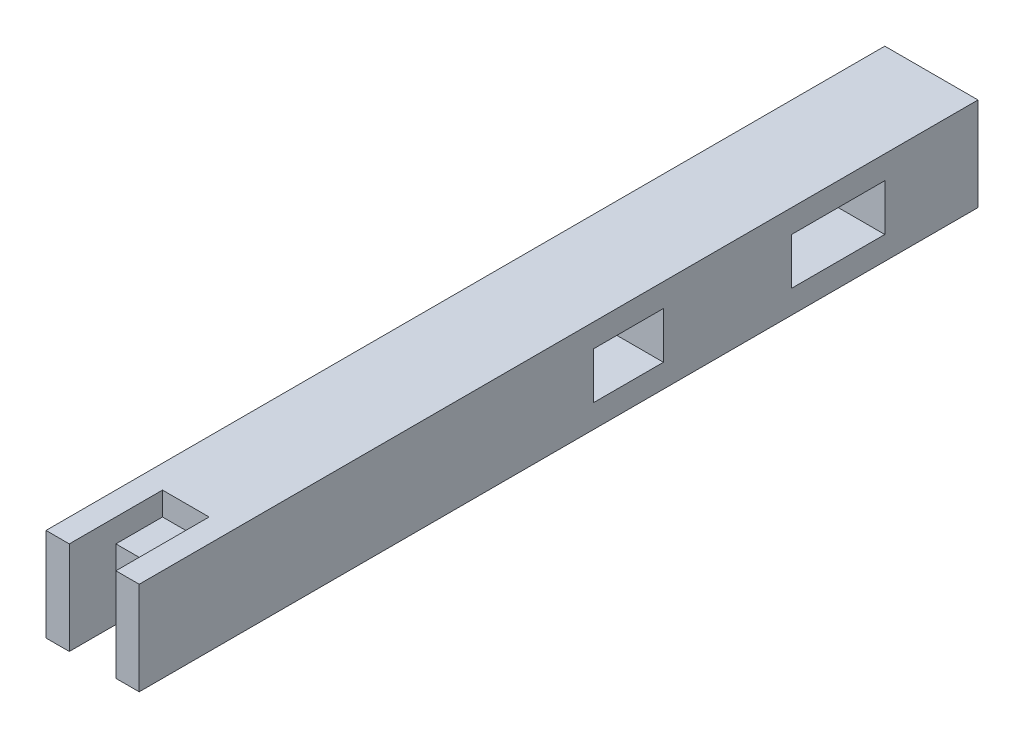
ISO-10303-21;
HEADER;
FILE_DESCRIPTION(('STEP AP214'),'2;1');
FILE_NAME('part.step','',(''),(''),'','','');
FILE_SCHEMA(('AUTOMOTIVE_DESIGN { 1 0 10303 214 1 1 1 1 }'));
ENDSEC;
DATA;
#1=APPLICATION_CONTEXT('core data for automotive mechanical design processes');
#2=APPLICATION_PROTOCOL_DEFINITION('international standard','automotive_design',2000,#1);
#3=PRODUCT_CONTEXT('',#1,'mechanical');
#4=PRODUCT('Part','Part','',(#3));
#5=PRODUCT_RELATED_PRODUCT_CATEGORY('part','',(#4));
#6=PRODUCT_DEFINITION_FORMATION('','',#4);
#7=PRODUCT_DEFINITION_CONTEXT('part definition',#1,'design');
#8=PRODUCT_DEFINITION('design','',#6,#7);
#9=PRODUCT_DEFINITION_SHAPE('','',#8);
#10=(LENGTH_UNIT() NAMED_UNIT(*) SI_UNIT(.MILLI.,.METRE.));
#11=(NAMED_UNIT(*) PLANE_ANGLE_UNIT() SI_UNIT($,.RADIAN.));
#12=(NAMED_UNIT(*) SI_UNIT($,.STERADIAN.) SOLID_ANGLE_UNIT());
#13=UNCERTAINTY_MEASURE_WITH_UNIT(LENGTH_MEASURE(1.E-05),#10,'distance_accuracy_value','');
#14=(GEOMETRIC_REPRESENTATION_CONTEXT(3) GLOBAL_UNCERTAINTY_ASSIGNED_CONTEXT((#13)) GLOBAL_UNIT_ASSIGNED_CONTEXT((#10,
#11,#12)) REPRESENTATION_CONTEXT('',''));
#15=CARTESIAN_POINT('',(0.,0.,0.));
#16=DIRECTION('',(0.,0.,1.));
#17=DIRECTION('',(1.,0.,0.));
#18=AXIS2_PLACEMENT_3D('',#15,#16,#17);
#19=CARTESIAN_POINT('',(0.,0.,914.4));
#20=DIRECTION('',(0.,0.,-1.));
#21=DIRECTION('',(-1.,0.,0.));
#22=AXIS2_PLACEMENT_3D('',#19,#20,#21);
#23=PLANE('',#22);
#24=DIRECTION('',(-1.,0.,0.));
#25=VECTOR('',#24,1.);
#26=CARTESIAN_POINT('',(-50.8,50.8,914.4));
#27=LINE('',#26,#25);
#28=CARTESIAN_POINT('',(50.8,50.8,914.4));
#29=VERTEX_POINT('',#28);
#30=CARTESIAN_POINT('',(25.4,50.8,914.4));
#31=VERTEX_POINT('',#30);
#32=EDGE_CURVE('E358',#29,#31,#27,.T.);
#33=ORIENTED_EDGE('',*,*,#32,.T.);
#34=DIRECTION('',(0.,1.,0.));
#35=VECTOR('',#34,1.);
#36=CARTESIAN_POINT('',(25.4,-50.8,914.4));
#37=LINE('',#36,#35);
#38=CARTESIAN_POINT('',(25.4,-50.8,914.4));
#39=VERTEX_POINT('',#38);
#40=EDGE_CURVE('E253',#39,#31,#37,.T.);
#41=ORIENTED_EDGE('',*,*,#40,.F.);
#42=DIRECTION('',(1.,0.,0.));
#43=VECTOR('',#42,1.);
#44=CARTESIAN_POINT('',(-50.8,-50.8,914.4));
#45=LINE('',#44,#43);
#46=CARTESIAN_POINT('',(50.8,-50.8,914.4));
#47=VERTEX_POINT('',#46);
#48=EDGE_CURVE('E365',#39,#47,#45,.T.);
#49=ORIENTED_EDGE('',*,*,#48,.T.);
#50=DIRECTION('',(0.,1.,0.));
#51=VECTOR('',#50,1.);
#52=CARTESIAN_POINT('',(50.8,-50.8,914.4));
#53=LINE('',#52,#51);
#54=EDGE_CURVE('E352',#47,#29,#53,.T.);
#55=ORIENTED_EDGE('',*,*,#54,.T.);
#56=EDGE_LOOP('',(#33,#41,#49,#55));
#57=FACE_BOUND('',#56,.T.);
#58=ADVANCED_FACE('F42',(#57),#23,.F.);
#59=CARTESIAN_POINT('',(50.8,-50.8,914.4));
#60=DIRECTION('',(-1.,0.,0.));
#61=DIRECTION('',(0.,0.,1.));
#62=AXIS2_PLACEMENT_3D('',#59,#60,#61);
#63=PLANE('',#62);
#64=DIRECTION('',(0.,0.,-1.));
#65=VECTOR('',#64,1.);
#66=CARTESIAN_POINT('',(50.8,25.4,419.1));
#67=LINE('',#66,#65);
#68=CARTESIAN_POINT('',(50.8,25.4,419.1));
#69=VERTEX_POINT('',#68);
#70=CARTESIAN_POINT('',(50.8,25.4,342.9));
#71=VERTEX_POINT('',#70);
#72=EDGE_CURVE('E189',#69,#71,#67,.T.);
#73=ORIENTED_EDGE('',*,*,#72,.T.);
#74=DIRECTION('',(0.,-1.,0.));
#75=VECTOR('',#74,1.);
#76=CARTESIAN_POINT('',(50.8,25.4,342.9));
#77=LINE('',#76,#75);
#78=CARTESIAN_POINT('',(50.8,-25.4,342.9));
#79=VERTEX_POINT('',#78);
#80=EDGE_CURVE('E182',#71,#79,#77,.T.);
#81=ORIENTED_EDGE('',*,*,#80,.T.);
#82=DIRECTION('',(0.,0.,1.));
#83=VECTOR('',#82,1.);
#84=CARTESIAN_POINT('',(50.8,-25.4,419.1));
#85=LINE('',#84,#83);
#86=CARTESIAN_POINT('',(50.8,-25.4,419.1));
#87=VERTEX_POINT('',#86);
#88=EDGE_CURVE('E192',#79,#87,#85,.T.);
#89=ORIENTED_EDGE('',*,*,#88,.T.);
#90=DIRECTION('',(0.,1.,0.));
#91=VECTOR('',#90,1.);
#92=CARTESIAN_POINT('',(50.8,25.4,419.1));
#93=LINE('',#92,#91);
#94=EDGE_CURVE('E58',#87,#69,#93,.T.);
#95=ORIENTED_EDGE('',*,*,#94,.T.);
#96=EDGE_LOOP('',(#73,#81,#89,#95));
#97=FACE_BOUND('',#96,.T.);
#98=DIRECTION('',(0.,0.,1.));
#99=VECTOR('',#98,1.);
#100=CARTESIAN_POINT('',(50.8,25.4,203.2));
#101=LINE('',#100,#99);
#102=CARTESIAN_POINT('',(50.8,25.4,101.6));
#103=VERTEX_POINT('',#102);
#104=CARTESIAN_POINT('',(50.8,25.4,203.2));
#105=VERTEX_POINT('',#104);
#106=EDGE_CURVE('E328',#103,#105,#101,.T.);
#107=ORIENTED_EDGE('',*,*,#106,.F.);
#108=DIRECTION('',(0.,1.,0.));
#109=VECTOR('',#108,1.);
#110=CARTESIAN_POINT('',(50.8,-25.4,101.6));
#111=LINE('',#110,#109);
#112=CARTESIAN_POINT('',(50.8,-25.4,101.6));
#113=VERTEX_POINT('',#112);
#114=EDGE_CURVE('E297',#113,#103,#111,.T.);
#115=ORIENTED_EDGE('',*,*,#114,.F.);
#116=DIRECTION('',(0.,0.,-1.));
#117=VECTOR('',#116,1.);
#118=CARTESIAN_POINT('',(50.8,-25.4,203.2));
#119=LINE('',#118,#117);
#120=CARTESIAN_POINT('',(50.8,-25.4,203.2));
#121=VERTEX_POINT('',#120);
#122=EDGE_CURVE('E313',#121,#113,#119,.T.);
#123=ORIENTED_EDGE('',*,*,#122,.F.);
#124=DIRECTION('',(0.,-1.,0.));
#125=VECTOR('',#124,1.);
#126=CARTESIAN_POINT('',(50.8,-25.4,203.2));
#127=LINE('',#126,#125);
#128=EDGE_CURVE('E332',#105,#121,#127,.T.);
#129=ORIENTED_EDGE('',*,*,#128,.F.);
#130=EDGE_LOOP('',(#107,#115,#123,#129));
#131=FACE_BOUND('',#130,.T.);
#132=DIRECTION('',(0.,1.,0.));
#133=VECTOR('',#132,1.);
#134=CARTESIAN_POINT('',(50.8,-50.8,0.));
#135=LINE('',#134,#133);
#136=CARTESIAN_POINT('',(50.8,-50.8,0.));
#137=VERTEX_POINT('',#136);
#138=CARTESIAN_POINT('',(50.8,50.8,0.));
#139=VERTEX_POINT('',#138);
#140=EDGE_CURVE('E342',#137,#139,#135,.T.);
#141=ORIENTED_EDGE('',*,*,#140,.T.);
#142=DIRECTION('',(0.,0.,-1.));
#143=VECTOR('',#142,1.);
#144=CARTESIAN_POINT('',(50.8,50.8,914.4));
#145=LINE('',#144,#143);
#146=EDGE_CURVE('E11',#29,#139,#145,.T.);
#147=ORIENTED_EDGE('',*,*,#146,.F.);
#148=ORIENTED_EDGE('',*,*,#54,.F.);
#149=DIRECTION('',(0.,0.,-1.));
#150=VECTOR('',#149,1.);
#151=CARTESIAN_POINT('',(50.8,-50.8,914.4));
#152=LINE('',#151,#150);
#153=EDGE_CURVE('E370',#47,#137,#152,.T.);
#154=ORIENTED_EDGE('',*,*,#153,.T.);
#155=EDGE_LOOP('',(#141,#147,#148,#154));
#156=FACE_BOUND('',#155,.T.);
#157=ADVANCED_FACE('F44',(#97,#131,#156),#63,.F.);
#158=CARTESIAN_POINT('',(-50.8,50.8,914.4));
#159=DIRECTION('',(0.,-1.,0.));
#160=DIRECTION('',(0.,0.,-1.));
#161=AXIS2_PLACEMENT_3D('',#158,#159,#160);
#162=PLANE('',#161);
#163=DIRECTION('',(0.,0.,1.));
#164=VECTOR('',#163,1.);
#165=CARTESIAN_POINT('',(-25.4,50.8,863.6));
#166=LINE('',#165,#164);
#167=CARTESIAN_POINT('',(-25.4,50.8,812.8));
#168=VERTEX_POINT('',#167);
#169=CARTESIAN_POINT('',(-25.4,50.8,914.4));
#170=VERTEX_POINT('',#169);
#171=EDGE_CURVE('E302',#168,#170,#166,.T.);
#172=ORIENTED_EDGE('',*,*,#171,.F.);
#173=DIRECTION('',(-1.,0.,0.));
#174=VECTOR('',#173,1.);
#175=CARTESIAN_POINT('',(-25.4,50.8,812.8));
#176=LINE('',#175,#174);
#177=CARTESIAN_POINT('',(25.4,50.8,812.8));
#178=VERTEX_POINT('',#177);
#179=EDGE_CURVE('E241',#178,#168,#176,.T.);
#180=ORIENTED_EDGE('',*,*,#179,.F.);
#181=DIRECTION('',(0.,0.,1.));
#182=VECTOR('',#181,1.);
#183=CARTESIAN_POINT('',(25.4,50.8,863.6));
#184=LINE('',#183,#182);
#185=EDGE_CURVE('E289',#178,#31,#184,.T.);
#186=ORIENTED_EDGE('',*,*,#185,.T.);
#187=ORIENTED_EDGE('',*,*,#32,.F.);
#188=ORIENTED_EDGE('',*,*,#146,.T.);
#189=DIRECTION('',(-1.,0.,0.));
#190=VECTOR('',#189,1.);
#191=CARTESIAN_POINT('',(-50.8,50.8,0.));
#192=LINE('',#191,#190);
#193=CARTESIAN_POINT('',(-50.8,50.8,0.));
#194=VERTEX_POINT('',#193);
#195=EDGE_CURVE('E374',#139,#194,#192,.T.);
#196=ORIENTED_EDGE('',*,*,#195,.T.);
#197=DIRECTION('',(0.,0.,-1.));
#198=VECTOR('',#197,1.);
#199=CARTESIAN_POINT('',(-50.8,50.8,914.4));
#200=LINE('',#199,#198);
#201=CARTESIAN_POINT('',(-50.8,50.8,914.4));
#202=VERTEX_POINT('',#201);
#203=EDGE_CURVE('E51',#202,#194,#200,.T.);
#204=ORIENTED_EDGE('',*,*,#203,.F.);
#205=EDGE_CURVE('E356',#170,#202,#27,.T.);
#206=ORIENTED_EDGE('',*,*,#205,.F.);
#207=EDGE_LOOP('',(#172,#180,#186,#187,#188,#196,#204,#206));
#208=FACE_BOUND('',#207,.T.);
#209=ADVANCED_FACE('F418',(#208),#162,.F.);
#210=CARTESIAN_POINT('',(-50.8,-50.8,914.4));
#211=DIRECTION('',(1.,0.,0.));
#212=DIRECTION('',(0.,0.,-1.));
#213=AXIS2_PLACEMENT_3D('',#210,#211,#212);
#214=PLANE('',#213);
#215=DIRECTION('',(0.,0.,1.));
#216=VECTOR('',#215,1.);
#217=CARTESIAN_POINT('',(-50.8,-25.4,419.1));
#218=LINE('',#217,#216);
#219=CARTESIAN_POINT('',(-50.8,-25.4,342.9));
#220=VERTEX_POINT('',#219);
#221=CARTESIAN_POINT('',(-50.8,-25.4,419.1));
#222=VERTEX_POINT('',#221);
#223=EDGE_CURVE('E213',#220,#222,#218,.T.);
#224=ORIENTED_EDGE('',*,*,#223,.F.);
#225=DIRECTION('',(0.,-1.,0.));
#226=VECTOR('',#225,1.);
#227=CARTESIAN_POINT('',(-50.8,25.4,342.9));
#228=LINE('',#227,#226);
#229=CARTESIAN_POINT('',(-50.8,25.4,342.9));
#230=VERTEX_POINT('',#229);
#231=EDGE_CURVE('E66',#230,#220,#228,.T.);
#232=ORIENTED_EDGE('',*,*,#231,.F.);
#233=DIRECTION('',(0.,0.,-1.));
#234=VECTOR('',#233,1.);
#235=CARTESIAN_POINT('',(-50.8,25.4,419.1));
#236=LINE('',#235,#234);
#237=CARTESIAN_POINT('',(-50.8,25.4,419.1));
#238=VERTEX_POINT('',#237);
#239=EDGE_CURVE('E200',#238,#230,#236,.T.);
#240=ORIENTED_EDGE('',*,*,#239,.F.);
#241=DIRECTION('',(0.,1.,0.));
#242=VECTOR('',#241,1.);
#243=CARTESIAN_POINT('',(-50.8,25.4,419.1));
#244=LINE('',#243,#242);
#245=EDGE_CURVE('E204',#222,#238,#244,.T.);
#246=ORIENTED_EDGE('',*,*,#245,.F.);
#247=EDGE_LOOP('',(#224,#232,#240,#246));
#248=FACE_BOUND('',#247,.T.);
#249=DIRECTION('',(0.,0.,-1.));
#250=VECTOR('',#249,1.);
#251=CARTESIAN_POINT('',(-50.8,-25.4,203.2));
#252=LINE('',#251,#250);
#253=CARTESIAN_POINT('',(-50.8,-25.4,203.2));
#254=VERTEX_POINT('',#253);
#255=CARTESIAN_POINT('',(-50.8,-25.4,101.6));
#256=VERTEX_POINT('',#255);
#257=EDGE_CURVE('E321',#254,#256,#252,.T.);
#258=ORIENTED_EDGE('',*,*,#257,.T.);
#259=DIRECTION('',(0.,1.,0.));
#260=VECTOR('',#259,1.);
#261=CARTESIAN_POINT('',(-50.8,-25.4,101.6));
#262=LINE('',#261,#260);
#263=CARTESIAN_POINT('',(-50.8,25.4,101.6));
#264=VERTEX_POINT('',#263);
#265=EDGE_CURVE('E308',#256,#264,#262,.T.);
#266=ORIENTED_EDGE('',*,*,#265,.T.);
#267=DIRECTION('',(0.,0.,1.));
#268=VECTOR('',#267,1.);
#269=CARTESIAN_POINT('',(-50.8,25.4,203.2));
#270=LINE('',#269,#268);
#271=CARTESIAN_POINT('',(-50.8,25.4,203.2));
#272=VERTEX_POINT('',#271);
#273=EDGE_CURVE('E312',#264,#272,#270,.T.);
#274=ORIENTED_EDGE('',*,*,#273,.T.);
#275=DIRECTION('',(0.,-1.,0.));
#276=VECTOR('',#275,1.);
#277=CARTESIAN_POINT('',(-50.8,-25.4,203.2));
#278=LINE('',#277,#276);
#279=EDGE_CURVE('E317',#272,#254,#278,.T.);
#280=ORIENTED_EDGE('',*,*,#279,.T.);
#281=EDGE_LOOP('',(#258,#266,#274,#280));
#282=FACE_BOUND('',#281,.T.);
#283=DIRECTION('',(0.,-1.,0.));
#284=VECTOR('',#283,1.);
#285=CARTESIAN_POINT('',(-50.8,-50.8,0.));
#286=LINE('',#285,#284);
#287=CARTESIAN_POINT('',(-50.8,-50.8,0.));
#288=VERTEX_POINT('',#287);
#289=EDGE_CURVE('E377',#194,#288,#286,.T.);
#290=ORIENTED_EDGE('',*,*,#289,.T.);
#291=DIRECTION('',(0.,0.,-1.));
#292=VECTOR('',#291,1.);
#293=CARTESIAN_POINT('',(-50.8,-50.8,914.4));
#294=LINE('',#293,#292);
#295=CARTESIAN_POINT('',(-50.8,-50.8,914.4));
#296=VERTEX_POINT('',#295);
#297=EDGE_CURVE('E385',#296,#288,#294,.T.);
#298=ORIENTED_EDGE('',*,*,#297,.F.);
#299=DIRECTION('',(0.,-1.,0.));
#300=VECTOR('',#299,1.);
#301=CARTESIAN_POINT('',(-50.8,-50.8,914.4));
#302=LINE('',#301,#300);
#303=EDGE_CURVE('E362',#202,#296,#302,.T.);
#304=ORIENTED_EDGE('',*,*,#303,.F.);
#305=ORIENTED_EDGE('',*,*,#203,.T.);
#306=EDGE_LOOP('',(#290,#298,#304,#305));
#307=FACE_BOUND('',#306,.T.);
#308=ADVANCED_FACE('F394',(#248,#282,#307),#214,.F.);
#309=CARTESIAN_POINT('',(-50.8,-50.8,914.4));
#310=DIRECTION('',(0.,1.,0.));
#311=DIRECTION('',(0.,0.,1.));
#312=AXIS2_PLACEMENT_3D('',#309,#310,#311);
#313=PLANE('',#312);
#314=DIRECTION('',(1.,0.,0.));
#315=VECTOR('',#314,1.);
#316=CARTESIAN_POINT('',(-25.4,-50.8,812.8));
#317=LINE('',#316,#315);
#318=CARTESIAN_POINT('',(-25.4,-50.8,812.8));
#319=VERTEX_POINT('',#318);
#320=CARTESIAN_POINT('',(25.4,-50.8,812.8));
#321=VERTEX_POINT('',#320);
#322=EDGE_CURVE('E273',#319,#321,#317,.T.);
#323=ORIENTED_EDGE('',*,*,#322,.F.);
#324=DIRECTION('',(0.,0.,1.));
#325=VECTOR('',#324,1.);
#326=CARTESIAN_POINT('',(-25.4,-50.8,863.6));
#327=LINE('',#326,#325);
#328=CARTESIAN_POINT('',(-25.4,-50.8,914.4));
#329=VERTEX_POINT('',#328);
#330=EDGE_CURVE('E298',#319,#329,#327,.T.);
#331=ORIENTED_EDGE('',*,*,#330,.T.);
#332=EDGE_CURVE('E366',#296,#329,#45,.T.);
#333=ORIENTED_EDGE('',*,*,#332,.F.);
#334=ORIENTED_EDGE('',*,*,#297,.T.);
#335=DIRECTION('',(1.,0.,0.));
#336=VECTOR('',#335,1.);
#337=CARTESIAN_POINT('',(-50.8,-50.8,0.));
#338=LINE('',#337,#336);
#339=EDGE_CURVE('E357',#288,#137,#338,.T.);
#340=ORIENTED_EDGE('',*,*,#339,.T.);
#341=ORIENTED_EDGE('',*,*,#153,.F.);
#342=ORIENTED_EDGE('',*,*,#48,.F.);
#343=DIRECTION('',(0.,0.,1.));
#344=VECTOR('',#343,1.);
#345=CARTESIAN_POINT('',(25.4,-50.8,863.6));
#346=LINE('',#345,#344);
#347=EDGE_CURVE('E294',#321,#39,#346,.T.);
#348=ORIENTED_EDGE('',*,*,#347,.F.);
#349=EDGE_LOOP('',(#323,#331,#333,#334,#340,#341,#342,#348));
#350=FACE_BOUND('',#349,.T.);
#351=ADVANCED_FACE('F405',(#350),#313,.F.);
#352=ORIENTED_EDGE('',*,*,#332,.T.);
#353=DIRECTION('',(0.,-1.,0.));
#354=VECTOR('',#353,1.);
#355=CARTESIAN_POINT('',(-25.4,-50.8,914.4));
#356=LINE('',#355,#354);
#357=EDGE_CURVE('E285',#170,#329,#356,.T.);
#358=ORIENTED_EDGE('',*,*,#357,.F.);
#359=ORIENTED_EDGE('',*,*,#205,.T.);
#360=ORIENTED_EDGE('',*,*,#303,.T.);
#361=EDGE_LOOP('',(#352,#358,#359,#360));
#362=FACE_BOUND('',#361,.T.);
#363=ADVANCED_FACE('F417',(#362),#23,.F.);
#364=CARTESIAN_POINT('',(0.,0.,0.));
#365=DIRECTION('',(0.,0.,-1.));
#366=DIRECTION('',(-1.,0.,0.));
#367=AXIS2_PLACEMENT_3D('',#364,#365,#366);
#368=PLANE('',#367);
#369=ORIENTED_EDGE('',*,*,#140,.F.);
#370=ORIENTED_EDGE('',*,*,#339,.F.);
#371=ORIENTED_EDGE('',*,*,#289,.F.);
#372=ORIENTED_EDGE('',*,*,#195,.F.);
#373=EDGE_LOOP('',(#369,#370,#371,#372));
#374=FACE_BOUND('',#373,.T.);
#375=ADVANCED_FACE('F401',(#374),#368,.T.);
#376=CARTESIAN_POINT('',(-50.8,-25.4,101.6));
#377=DIRECTION('',(0.,0.,-1.));
#378=DIRECTION('',(-1.,0.,0.));
#379=AXIS2_PLACEMENT_3D('',#376,#377,#378);
#380=PLANE('',#379);
#381=ORIENTED_EDGE('',*,*,#114,.T.);
#382=DIRECTION('',(1.,0.,0.));
#383=VECTOR('',#382,1.);
#384=CARTESIAN_POINT('',(-50.8,25.4,101.6));
#385=LINE('',#384,#383);
#386=EDGE_CURVE('E325',#264,#103,#385,.T.);
#387=ORIENTED_EDGE('',*,*,#386,.F.);
#388=ORIENTED_EDGE('',*,*,#265,.F.);
#389=DIRECTION('',(1.,0.,0.));
#390=VECTOR('',#389,1.);
#391=CARTESIAN_POINT('',(-50.8,-25.4,101.6));
#392=LINE('',#391,#390);
#393=EDGE_CURVE('E339',#256,#113,#392,.T.);
#394=ORIENTED_EDGE('',*,*,#393,.T.);
#395=EDGE_LOOP('',(#381,#387,#388,#394));
#396=FACE_BOUND('',#395,.T.);
#397=ADVANCED_FACE('F466',(#396),#380,.F.);
#398=CARTESIAN_POINT('',(-50.8,-25.4,203.2));
#399=DIRECTION('',(0.,-1.,0.));
#400=DIRECTION('',(0.,0.,-1.));
#401=AXIS2_PLACEMENT_3D('',#398,#399,#400);
#402=PLANE('',#401);
#403=ORIENTED_EDGE('',*,*,#122,.T.);
#404=ORIENTED_EDGE('',*,*,#393,.F.);
#405=ORIENTED_EDGE('',*,*,#257,.F.);
#406=DIRECTION('',(1.,0.,0.));
#407=VECTOR('',#406,1.);
#408=CARTESIAN_POINT('',(-50.8,-25.4,203.2));
#409=LINE('',#408,#407);
#410=EDGE_CURVE('E343',#254,#121,#409,.T.);
#411=ORIENTED_EDGE('',*,*,#410,.T.);
#412=EDGE_LOOP('',(#403,#404,#405,#411));
#413=FACE_BOUND('',#412,.T.);
#414=ADVANCED_FACE('F603',(#413),#402,.F.);
#415=CARTESIAN_POINT('',(-50.8,-25.4,203.2));
#416=DIRECTION('',(0.,0.,1.));
#417=DIRECTION('',(1.,0.,0.));
#418=AXIS2_PLACEMENT_3D('',#415,#416,#417);
#419=PLANE('',#418);
#420=ORIENTED_EDGE('',*,*,#128,.T.);
#421=ORIENTED_EDGE('',*,*,#410,.F.);
#422=ORIENTED_EDGE('',*,*,#279,.F.);
#423=DIRECTION('',(1.,0.,0.));
#424=VECTOR('',#423,1.);
#425=CARTESIAN_POINT('',(-50.8,25.4,203.2));
#426=LINE('',#425,#424);
#427=EDGE_CURVE('E346',#272,#105,#426,.T.);
#428=ORIENTED_EDGE('',*,*,#427,.T.);
#429=EDGE_LOOP('',(#420,#421,#422,#428));
#430=FACE_BOUND('',#429,.T.);
#431=ADVANCED_FACE('F594',(#430),#419,.F.);
#432=CARTESIAN_POINT('',(-50.8,25.4,203.2));
#433=DIRECTION('',(0.,1.,0.));
#434=DIRECTION('',(0.,0.,1.));
#435=AXIS2_PLACEMENT_3D('',#432,#433,#434);
#436=PLANE('',#435);
#437=ORIENTED_EDGE('',*,*,#106,.T.);
#438=ORIENTED_EDGE('',*,*,#427,.F.);
#439=ORIENTED_EDGE('',*,*,#273,.F.);
#440=ORIENTED_EDGE('',*,*,#386,.T.);
#441=EDGE_LOOP('',(#437,#438,#439,#440));
#442=FACE_BOUND('',#441,.T.);
#443=ADVANCED_FACE('F579',(#442),#436,.F.);
#444=CARTESIAN_POINT('',(25.4,-50.8,863.6));
#445=DIRECTION('',(1.,0.,0.));
#446=DIRECTION('',(0.,0.,-1.));
#447=AXIS2_PLACEMENT_3D('',#444,#445,#446);
#448=PLANE('',#447);
#449=ORIENTED_EDGE('',*,*,#40,.T.);
#450=ORIENTED_EDGE('',*,*,#185,.F.);
#451=DIRECTION('',(0.,1.,0.));
#452=VECTOR('',#451,1.);
#453=CARTESIAN_POINT('',(25.4,50.8,812.8));
#454=LINE('',#453,#452);
#455=CARTESIAN_POINT('',(25.4,25.4,812.8));
#456=VERTEX_POINT('',#455);
#457=EDGE_CURVE('E237',#456,#178,#454,.T.);
#458=ORIENTED_EDGE('',*,*,#457,.F.);
#459=DIRECTION('',(0.,0.,1.));
#460=VECTOR('',#459,1.);
#461=CARTESIAN_POINT('',(25.4,25.4,812.8));
#462=LINE('',#461,#460);
#463=CARTESIAN_POINT('',(25.4,25.4,863.6));
#464=VERTEX_POINT('',#463);
#465=EDGE_CURVE('E250',#456,#464,#462,.T.);
#466=ORIENTED_EDGE('',*,*,#465,.T.);
#467=DIRECTION('',(0.,1.,0.));
#468=VECTOR('',#467,1.);
#469=CARTESIAN_POINT('',(25.4,-50.8,863.6));
#470=LINE('',#469,#468);
#471=CARTESIAN_POINT('',(25.4,-25.4,863.6));
#472=VERTEX_POINT('',#471);
#473=EDGE_CURVE('E280',#472,#464,#470,.T.);
#474=ORIENTED_EDGE('',*,*,#473,.F.);
#475=DIRECTION('',(0.,0.,1.));
#476=VECTOR('',#475,1.);
#477=CARTESIAN_POINT('',(25.4,-25.4,812.8));
#478=LINE('',#477,#476);
#479=CARTESIAN_POINT('',(25.4,-25.4,812.8));
#480=VERTEX_POINT('',#479);
#481=EDGE_CURVE('E256',#480,#472,#478,.T.);
#482=ORIENTED_EDGE('',*,*,#481,.F.);
#483=DIRECTION('',(0.,1.,0.));
#484=VECTOR('',#483,1.);
#485=CARTESIAN_POINT('',(25.4,-50.8,812.8));
#486=LINE('',#485,#484);
#487=EDGE_CURVE('E269',#321,#480,#486,.T.);
#488=ORIENTED_EDGE('',*,*,#487,.F.);
#489=ORIENTED_EDGE('',*,*,#347,.T.);
#490=EDGE_LOOP('',(#449,#450,#458,#466,#474,#482,#488,#489));
#491=FACE_BOUND('',#490,.T.);
#492=ADVANCED_FACE('F429',(#491),#448,.F.);
#493=CARTESIAN_POINT('',(-25.4,-50.8,863.6));
#494=DIRECTION('',(-1.,0.,0.));
#495=DIRECTION('',(0.,0.,1.));
#496=AXIS2_PLACEMENT_3D('',#493,#494,#495);
#497=PLANE('',#496);
#498=ORIENTED_EDGE('',*,*,#357,.T.);
#499=ORIENTED_EDGE('',*,*,#330,.F.);
#500=DIRECTION('',(0.,-1.,0.));
#501=VECTOR('',#500,1.);
#502=CARTESIAN_POINT('',(-25.4,-50.8,812.8));
#503=LINE('',#502,#501);
#504=CARTESIAN_POINT('',(-25.4,-25.4,812.8));
#505=VERTEX_POINT('',#504);
#506=EDGE_CURVE('E265',#505,#319,#503,.T.);
#507=ORIENTED_EDGE('',*,*,#506,.F.);
#508=DIRECTION('',(0.,0.,1.));
#509=VECTOR('',#508,1.);
#510=CARTESIAN_POINT('',(-25.4,-25.4,812.8));
#511=LINE('',#510,#509);
#512=CARTESIAN_POINT('',(-25.4,-25.4,863.6));
#513=VERTEX_POINT('',#512);
#514=EDGE_CURVE('E222',#505,#513,#511,.T.);
#515=ORIENTED_EDGE('',*,*,#514,.T.);
#516=DIRECTION('',(0.,-1.,0.));
#517=VECTOR('',#516,1.);
#518=CARTESIAN_POINT('',(-25.4,-50.8,863.6));
#519=LINE('',#518,#517);
#520=CARTESIAN_POINT('',(-25.4,25.4,863.6));
#521=VERTEX_POINT('',#520);
#522=EDGE_CURVE('E284',#521,#513,#519,.T.);
#523=ORIENTED_EDGE('',*,*,#522,.F.);
#524=DIRECTION('',(0.,0.,1.));
#525=VECTOR('',#524,1.);
#526=CARTESIAN_POINT('',(-25.4,25.4,812.8));
#527=LINE('',#526,#525);
#528=CARTESIAN_POINT('',(-25.4,25.4,812.8));
#529=VERTEX_POINT('',#528);
#530=EDGE_CURVE('E245',#529,#521,#527,.T.);
#531=ORIENTED_EDGE('',*,*,#530,.F.);
#532=DIRECTION('',(0.,-1.,0.));
#533=VECTOR('',#532,1.);
#534=CARTESIAN_POINT('',(-25.4,50.8,812.8));
#535=LINE('',#534,#533);
#536=EDGE_CURVE('E228',#168,#529,#535,.T.);
#537=ORIENTED_EDGE('',*,*,#536,.F.);
#538=ORIENTED_EDGE('',*,*,#171,.T.);
#539=EDGE_LOOP('',(#498,#499,#507,#515,#523,#531,#537,#538));
#540=FACE_BOUND('',#539,.T.);
#541=ADVANCED_FACE('F422',(#540),#497,.F.);
#542=CARTESIAN_POINT('',(0.,0.,863.6));
#543=DIRECTION('',(0.,0.,-1.));
#544=DIRECTION('',(-1.,0.,0.));
#545=AXIS2_PLACEMENT_3D('',#542,#543,#544);
#546=PLANE('',#545);
#547=ORIENTED_EDGE('',*,*,#473,.T.);
#548=DIRECTION('',(1.,0.,0.));
#549=VECTOR('',#548,1.);
#550=CARTESIAN_POINT('',(-25.4,25.4,863.6));
#551=LINE('',#550,#549);
#552=EDGE_CURVE('E233',#521,#464,#551,.T.);
#553=ORIENTED_EDGE('',*,*,#552,.F.);
#554=ORIENTED_EDGE('',*,*,#522,.T.);
#555=DIRECTION('',(-1.,0.,0.));
#556=VECTOR('',#555,1.);
#557=CARTESIAN_POINT('',(-25.4,-25.4,863.6));
#558=LINE('',#557,#556);
#559=EDGE_CURVE('E249',#472,#513,#558,.T.);
#560=ORIENTED_EDGE('',*,*,#559,.F.);
#561=EDGE_LOOP('',(#547,#553,#554,#560));
#562=FACE_BOUND('',#561,.T.);
#563=ADVANCED_FACE('F441',(#562),#546,.F.);
#564=CARTESIAN_POINT('',(-25.4,-25.4,812.8));
#565=DIRECTION('',(0.,1.,0.));
#566=DIRECTION('',(0.,0.,1.));
#567=AXIS2_PLACEMENT_3D('',#564,#565,#566);
#568=PLANE('',#567);
#569=ORIENTED_EDGE('',*,*,#559,.T.);
#570=ORIENTED_EDGE('',*,*,#514,.F.);
#571=DIRECTION('',(-1.,0.,0.));
#572=VECTOR('',#571,1.);
#573=CARTESIAN_POINT('',(-25.4,-25.4,812.8));
#574=LINE('',#573,#572);
#575=EDGE_CURVE('E259',#480,#505,#574,.T.);
#576=ORIENTED_EDGE('',*,*,#575,.F.);
#577=ORIENTED_EDGE('',*,*,#481,.T.);
#578=EDGE_LOOP('',(#569,#570,#576,#577));
#579=FACE_BOUND('',#578,.T.);
#580=ADVANCED_FACE('F438',(#579),#568,.F.);
#581=CARTESIAN_POINT('',(0.,0.,812.8));
#582=DIRECTION('',(0.,0.,-1.));
#583=DIRECTION('',(-1.,0.,0.));
#584=AXIS2_PLACEMENT_3D('',#581,#582,#583);
#585=PLANE('',#584);
#586=ORIENTED_EDGE('',*,*,#506,.T.);
#587=ORIENTED_EDGE('',*,*,#322,.T.);
#588=ORIENTED_EDGE('',*,*,#487,.T.);
#589=ORIENTED_EDGE('',*,*,#575,.T.);
#590=EDGE_LOOP('',(#586,#587,#588,#589));
#591=FACE_BOUND('',#590,.T.);
#592=ADVANCED_FACE('F433',(#591),#585,.F.);
#593=CARTESIAN_POINT('',(-25.4,25.4,812.8));
#594=DIRECTION('',(0.,-1.,0.));
#595=DIRECTION('',(1.,0.,0.));
#596=AXIS2_PLACEMENT_3D('',#593,#594,#595);
#597=PLANE('',#596);
#598=ORIENTED_EDGE('',*,*,#552,.T.);
#599=ORIENTED_EDGE('',*,*,#465,.F.);
#600=DIRECTION('',(1.,0.,0.));
#601=VECTOR('',#600,1.);
#602=CARTESIAN_POINT('',(-25.4,25.4,812.8));
#603=LINE('',#602,#601);
#604=EDGE_CURVE('E232',#529,#456,#603,.T.);
#605=ORIENTED_EDGE('',*,*,#604,.F.);
#606=ORIENTED_EDGE('',*,*,#530,.T.);
#607=EDGE_LOOP('',(#598,#599,#605,#606));
#608=FACE_BOUND('',#607,.T.);
#609=ADVANCED_FACE('F443',(#608),#597,.F.);
#610=CARTESIAN_POINT('',(0.,0.,812.8));
#611=DIRECTION('',(0.,0.,1.));
#612=DIRECTION('',(1.,0.,0.));
#613=AXIS2_PLACEMENT_3D('',#610,#611,#612);
#614=PLANE('',#613);
#615=ORIENTED_EDGE('',*,*,#536,.T.);
#616=ORIENTED_EDGE('',*,*,#604,.T.);
#617=ORIENTED_EDGE('',*,*,#457,.T.);
#618=ORIENTED_EDGE('',*,*,#179,.T.);
#619=EDGE_LOOP('',(#615,#616,#617,#618));
#620=FACE_BOUND('',#619,.T.);
#621=ADVANCED_FACE('F426',(#620),#614,.T.);
#622=CARTESIAN_POINT('',(50.8,25.4,342.9));
#623=DIRECTION('',(0.,0.,-1.));
#624=DIRECTION('',(-1.,0.,0.));
#625=AXIS2_PLACEMENT_3D('',#622,#623,#624);
#626=PLANE('',#625);
#627=ORIENTED_EDGE('',*,*,#231,.T.);
#628=DIRECTION('',(-1.,0.,0.));
#629=VECTOR('',#628,1.);
#630=CARTESIAN_POINT('',(50.8,-25.4,342.9));
#631=LINE('',#630,#629);
#632=EDGE_CURVE('E178',#79,#220,#631,.T.);
#633=ORIENTED_EDGE('',*,*,#632,.F.);
#634=ORIENTED_EDGE('',*,*,#80,.F.);
#635=DIRECTION('',(-1.,0.,0.));
#636=VECTOR('',#635,1.);
#637=CARTESIAN_POINT('',(50.8,25.4,342.9));
#638=LINE('',#637,#636);
#639=EDGE_CURVE('E219',#71,#230,#638,.T.);
#640=ORIENTED_EDGE('',*,*,#639,.T.);
#641=EDGE_LOOP('',(#627,#633,#634,#640));
#642=FACE_BOUND('',#641,.T.);
#643=ADVANCED_FACE('F180',(#642),#626,.F.);
#644=CARTESIAN_POINT('',(50.8,25.4,419.1));
#645=DIRECTION('',(0.,1.,0.));
#646=DIRECTION('',(0.,0.,1.));
#647=AXIS2_PLACEMENT_3D('',#644,#645,#646);
#648=PLANE('',#647);
#649=ORIENTED_EDGE('',*,*,#239,.T.);
#650=ORIENTED_EDGE('',*,*,#639,.F.);
#651=ORIENTED_EDGE('',*,*,#72,.F.);
#652=DIRECTION('',(-1.,0.,0.));
#653=VECTOR('',#652,1.);
#654=CARTESIAN_POINT('',(50.8,25.4,419.1));
#655=LINE('',#654,#653);
#656=EDGE_CURVE('E223',#69,#238,#655,.T.);
#657=ORIENTED_EDGE('',*,*,#656,.T.);
#658=EDGE_LOOP('',(#649,#650,#651,#657));
#659=FACE_BOUND('',#658,.T.);
#660=ADVANCED_FACE('F495',(#659),#648,.F.);
#661=CARTESIAN_POINT('',(50.8,25.4,419.1));
#662=DIRECTION('',(0.,0.,1.));
#663=DIRECTION('',(1.,0.,0.));
#664=AXIS2_PLACEMENT_3D('',#661,#662,#663);
#665=PLANE('',#664);
#666=ORIENTED_EDGE('',*,*,#245,.T.);
#667=ORIENTED_EDGE('',*,*,#656,.F.);
#668=ORIENTED_EDGE('',*,*,#94,.F.);
#669=DIRECTION('',(-1.,0.,0.));
#670=VECTOR('',#669,1.);
#671=CARTESIAN_POINT('',(50.8,-25.4,419.1));
#672=LINE('',#671,#670);
#673=EDGE_CURVE('E188',#87,#222,#672,.T.);
#674=ORIENTED_EDGE('',*,*,#673,.T.);
#675=EDGE_LOOP('',(#666,#667,#668,#674));
#676=FACE_BOUND('',#675,.T.);
#677=ADVANCED_FACE('F506',(#676),#665,.F.);
#678=CARTESIAN_POINT('',(50.8,-25.4,419.1));
#679=DIRECTION('',(0.,-1.,0.));
#680=DIRECTION('',(0.,0.,-1.));
#681=AXIS2_PLACEMENT_3D('',#678,#679,#680);
#682=PLANE('',#681);
#683=ORIENTED_EDGE('',*,*,#223,.T.);
#684=ORIENTED_EDGE('',*,*,#673,.F.);
#685=ORIENTED_EDGE('',*,*,#88,.F.);
#686=ORIENTED_EDGE('',*,*,#632,.T.);
#687=EDGE_LOOP('',(#683,#684,#685,#686));
#688=FACE_BOUND('',#687,.T.);
#689=ADVANCED_FACE('F193',(#688),#682,.F.);
#690=CLOSED_SHELL('',(#58,#157,#209,#308,#351,#363,#375,#397,#414,#431,#443,#492,#541,#563,#580,
#592,#609,#621,#643,#660,#677,#689));
#691=MANIFOLD_SOLID_BREP('B2',#690);
#692=ADVANCED_BREP_SHAPE_REPRESENTATION('',(#18,#691),#14);
#693=SHAPE_DEFINITION_REPRESENTATION(#9,#692);
ENDSEC;
END-ISO-10303-21;
